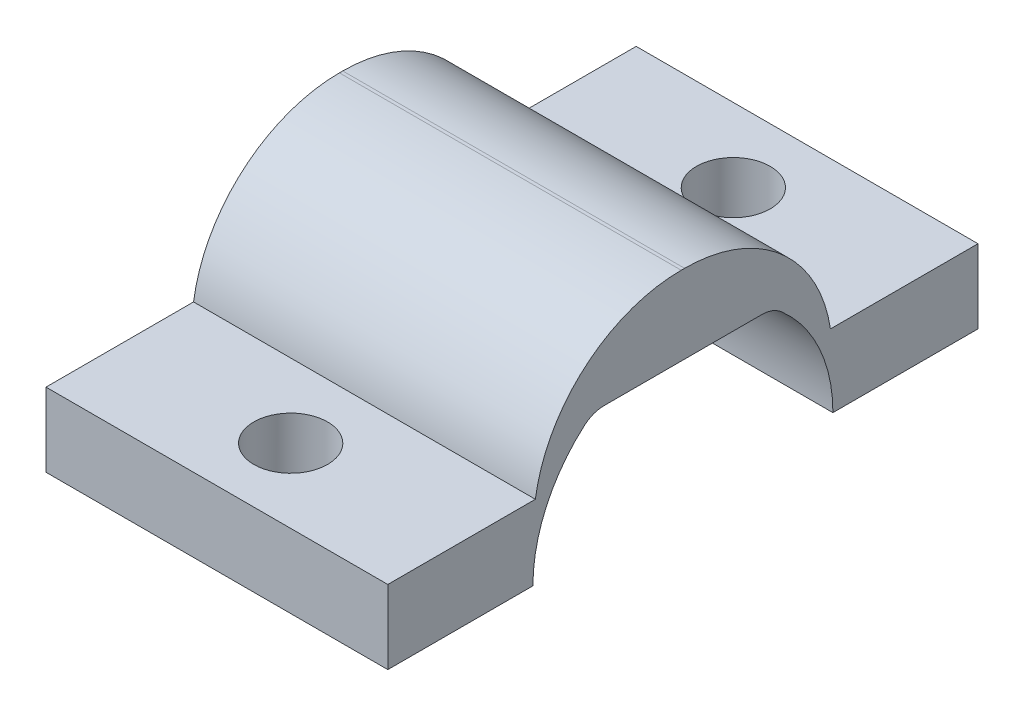
ISO-10303-21;
HEADER;
FILE_DESCRIPTION(('STEP AP214'),'2;1');
FILE_NAME('part.step','',(''),(''),'','','');
FILE_SCHEMA(('AUTOMOTIVE_DESIGN { 1 0 10303 214 1 1 1 1 }'));
ENDSEC;
DATA;
#1=APPLICATION_CONTEXT('core data for automotive mechanical design processes');
#2=APPLICATION_PROTOCOL_DEFINITION('international standard','automotive_design',2000,#1);
#3=PRODUCT_CONTEXT('',#1,'mechanical');
#4=PRODUCT('Part','Part','',(#3));
#5=PRODUCT_RELATED_PRODUCT_CATEGORY('part','',(#4));
#6=PRODUCT_DEFINITION_FORMATION('','',#4);
#7=PRODUCT_DEFINITION_CONTEXT('part definition',#1,'design');
#8=PRODUCT_DEFINITION('design','',#6,#7);
#9=PRODUCT_DEFINITION_SHAPE('','',#8);
#10=(LENGTH_UNIT() NAMED_UNIT(*) SI_UNIT(.MILLI.,.METRE.));
#11=(NAMED_UNIT(*) PLANE_ANGLE_UNIT() SI_UNIT($,.RADIAN.));
#12=(NAMED_UNIT(*) SI_UNIT($,.STERADIAN.) SOLID_ANGLE_UNIT());
#13=UNCERTAINTY_MEASURE_WITH_UNIT(LENGTH_MEASURE(1.E-05),#10,'distance_accuracy_value','');
#14=(GEOMETRIC_REPRESENTATION_CONTEXT(3) GLOBAL_UNCERTAINTY_ASSIGNED_CONTEXT((#13)) GLOBAL_UNIT_ASSIGNED_CONTEXT((#10,
#11,#12)) REPRESENTATION_CONTEXT('',''));
#15=CARTESIAN_POINT('',(0.,0.,0.));
#16=DIRECTION('',(0.,0.,1.));
#17=DIRECTION('',(1.,0.,0.));
#18=AXIS2_PLACEMENT_3D('',#15,#16,#17);
#19=CARTESIAN_POINT('',(15.9,0.,0.));
#20=DIRECTION('',(-1.,0.,0.));
#21=DIRECTION('',(0.,0.,1.));
#22=AXIS2_PLACEMENT_3D('',#19,#20,#21);
#23=CYLINDRICAL_SURFACE('',#22,6.1);
#24=CARTESIAN_POINT('',(2.,0.,0.));
#25=DIRECTION('',(1.,0.,0.));
#26=DIRECTION('',(0.,0.,-1.));
#27=AXIS2_PLACEMENT_3D('',#24,#25,#26);
#28=CIRCLE('',#27,6.1);
#29=CARTESIAN_POINT('',(2.,4.60612244897959,3.99920441900714));
#30=VERTEX_POINT('',#29);
#31=CARTESIAN_POINT('',(2.,0.,6.1));
#32=VERTEX_POINT('',#31);
#33=EDGE_CURVE('E214',#30,#32,#28,.T.);
#34=ORIENTED_EDGE('',*,*,#33,.F.);
#35=DIRECTION('',(-1.,0.,0.));
#36=VECTOR('',#35,1.);
#37=CARTESIAN_POINT('',(15.9,4.60612244897959,3.99920441900714));
#38=LINE('',#37,#36);
#39=CARTESIAN_POINT('',(15.9,4.60612244897959,3.99920441900714));
#40=VERTEX_POINT('',#39);
#41=EDGE_CURVE('E71',#30,#40,#38,.F.);
#42=ORIENTED_EDGE('',*,*,#41,.T.);
#43=CARTESIAN_POINT('',(15.9,0.,0.));
#44=DIRECTION('',(1.,0.,0.));
#45=DIRECTION('',(0.,0.,-1.));
#46=AXIS2_PLACEMENT_3D('',#43,#44,#45);
#47=CIRCLE('',#46,6.1);
#48=CARTESIAN_POINT('',(15.9,0.,6.1));
#49=VERTEX_POINT('',#48);
#50=EDGE_CURVE('E237',#40,#49,#47,.T.);
#51=ORIENTED_EDGE('',*,*,#50,.T.);
#52=DIRECTION('',(-1.,0.,0.));
#53=VECTOR('',#52,1.);
#54=CARTESIAN_POINT('',(15.9,0.,6.1));
#55=LINE('',#54,#53);
#56=EDGE_CURVE('E257',#49,#32,#55,.T.);
#57=ORIENTED_EDGE('',*,*,#56,.T.);
#58=EDGE_LOOP('',(#34,#42,#51,#57));
#59=FACE_BOUND('',#58,.T.);
#60=ADVANCED_FACE('F47',(#59),#23,.F.);
#61=CARTESIAN_POINT('',(15.9,4.9,0.));
#62=DIRECTION('',(0.,1.,0.));
#63=DIRECTION('',(0.,0.,1.));
#64=AXIS2_PLACEMENT_3D('',#61,#62,#63);
#65=PLANE('',#64);
#66=DIRECTION('',(-1.,0.,0.));
#67=VECTOR('',#66,1.);
#68=CARTESIAN_POINT('',(15.9,4.9,3.2124756808418));
#69=LINE('',#68,#67);
#70=CARTESIAN_POINT('',(15.9,4.9,3.2124756808418));
#71=VERTEX_POINT('',#70);
#72=CARTESIAN_POINT('',(2.,4.9,3.2124756808418));
#73=VERTEX_POINT('',#72);
#74=EDGE_CURVE('E289',#71,#73,#69,.T.);
#75=ORIENTED_EDGE('',*,*,#74,.T.);
#76=DIRECTION('',(0.,0.,-1.));
#77=VECTOR('',#76,1.);
#78=CARTESIAN_POINT('',(2.,4.9,0.));
#79=LINE('',#78,#77);
#80=CARTESIAN_POINT('',(2.,4.9,-3.2124756808418));
#81=VERTEX_POINT('',#80);
#82=EDGE_CURVE('E64',#73,#81,#79,.T.);
#83=ORIENTED_EDGE('',*,*,#82,.T.);
#84=DIRECTION('',(-1.,0.,0.));
#85=VECTOR('',#84,1.);
#86=CARTESIAN_POINT('',(15.9,4.9,-3.2124756808418));
#87=LINE('',#86,#85);
#88=CARTESIAN_POINT('',(15.9,4.9,-3.2124756808418));
#89=VERTEX_POINT('',#88);
#90=EDGE_CURVE('E293',#81,#89,#87,.F.);
#91=ORIENTED_EDGE('',*,*,#90,.T.);
#92=DIRECTION('',(0.,0.,-1.));
#93=VECTOR('',#92,1.);
#94=CARTESIAN_POINT('',(15.9,4.9,0.));
#95=LINE('',#94,#93);
#96=EDGE_CURVE('E240',#71,#89,#95,.T.);
#97=ORIENTED_EDGE('',*,*,#96,.F.);
#98=EDGE_LOOP('',(#75,#83,#91,#97));
#99=FACE_BOUND('',#98,.T.);
#100=ADVANCED_FACE('F309',(#99),#65,.F.);
#101=CARTESIAN_POINT('',(2.,0.,0.));
#102=DIRECTION('',(1.,0.,0.));
#103=DIRECTION('',(0.,0.,-1.));
#104=AXIS2_PLACEMENT_3D('',#101,#102,#103);
#105=CIRCLE('',#104,6.1);
#106=CARTESIAN_POINT('',(2.,0.,-6.1));
#107=VERTEX_POINT('',#106);
#108=CARTESIAN_POINT('',(2.,4.60612244897959,-3.99920441900714));
#109=VERTEX_POINT('',#108);
#110=EDGE_CURVE('E221',#107,#109,#105,.T.);
#111=ORIENTED_EDGE('',*,*,#110,.F.);
#112=DIRECTION('',(-1.,0.,0.));
#113=VECTOR('',#112,1.);
#114=CARTESIAN_POINT('',(15.9,0.,-6.1));
#115=LINE('',#114,#113);
#116=CARTESIAN_POINT('',(15.9,0.,-6.1));
#117=VERTEX_POINT('',#116);
#118=EDGE_CURVE('E269',#117,#107,#115,.T.);
#119=ORIENTED_EDGE('',*,*,#118,.F.);
#120=CARTESIAN_POINT('',(15.9,4.60612244897959,-3.99920441900714));
#121=VERTEX_POINT('',#120);
#122=EDGE_CURVE('E158',#117,#121,#47,.T.);
#123=ORIENTED_EDGE('',*,*,#122,.T.);
#124=DIRECTION('',(-1.,0.,0.));
#125=VECTOR('',#124,1.);
#126=CARTESIAN_POINT('',(15.9,4.60612244897959,-3.99920441900714));
#127=LINE('',#126,#125);
#128=EDGE_CURVE('E285',#121,#109,#127,.T.);
#129=ORIENTED_EDGE('',*,*,#128,.T.);
#130=EDGE_LOOP('',(#111,#119,#123,#129));
#131=FACE_BOUND('',#130,.T.);
#132=ADVANCED_FACE('F350',(#131),#23,.F.);
#133=CARTESIAN_POINT('',(15.9,0.,0.));
#134=DIRECTION('',(0.,1.,0.));
#135=DIRECTION('',(0.,0.,1.));
#136=AXIS2_PLACEMENT_3D('',#133,#134,#135);
#137=PLANE('',#136);
#138=CARTESIAN_POINT('',(8.95,0.,-9.));
#139=DIRECTION('',(0.,1.,0.));
#140=DIRECTION('',(0.,0.,1.));
#141=AXIS2_PLACEMENT_3D('',#138,#139,#140);
#142=CIRCLE('',#141,1.5);
#143=CARTESIAN_POINT('',(8.95,0.,-7.5));
#144=VERTEX_POINT('',#143);
#145=EDGE_CURVE('E179',#144,#144,#142,.T.);
#146=ORIENTED_EDGE('',*,*,#145,.T.);
#147=EDGE_LOOP('',(#146));
#148=FACE_BOUND('',#147,.T.);
#149=ORIENTED_EDGE('',*,*,#118,.T.);
#150=DIRECTION('',(0.,0.,-1.));
#151=VECTOR('',#150,1.);
#152=CARTESIAN_POINT('',(2.,0.,-10.));
#153=LINE('',#152,#151);
#154=CARTESIAN_POINT('',(2.,0.,-12.));
#155=VERTEX_POINT('',#154);
#156=EDGE_CURVE('E167',#107,#155,#153,.T.);
#157=ORIENTED_EDGE('',*,*,#156,.T.);
#158=DIRECTION('',(-1.,0.,0.));
#159=VECTOR('',#158,1.);
#160=CARTESIAN_POINT('',(15.9,0.,-12.));
#161=LINE('',#160,#159);
#162=CARTESIAN_POINT('',(15.9,0.,-12.));
#163=VERTEX_POINT('',#162);
#164=EDGE_CURVE('E165',#163,#155,#161,.T.);
#165=ORIENTED_EDGE('',*,*,#164,.F.);
#166=DIRECTION('',(0.,0.,-1.));
#167=VECTOR('',#166,1.);
#168=CARTESIAN_POINT('',(15.9,0.,0.));
#169=LINE('',#168,#167);
#170=EDGE_CURVE('E151',#117,#163,#169,.T.);
#171=ORIENTED_EDGE('',*,*,#170,.F.);
#172=EDGE_LOOP('',(#149,#157,#165,#171));
#173=FACE_BOUND('',#172,.T.);
#174=ADVANCED_FACE('F166',(#148,#173),#137,.F.);
#175=CARTESIAN_POINT('',(15.9,3.,0.));
#176=DIRECTION('',(0.,-1.,0.));
#177=DIRECTION('',(0.,0.,-1.));
#178=AXIS2_PLACEMENT_3D('',#175,#176,#177);
#179=PLANE('',#178);
#180=CARTESIAN_POINT('',(8.95,3.,-9.));
#181=DIRECTION('',(0.,1.,0.));
#182=DIRECTION('',(0.,0.,1.));
#183=AXIS2_PLACEMENT_3D('',#180,#181,#182);
#184=CIRCLE('',#183,1.5);
#185=CARTESIAN_POINT('',(8.95,3.,-7.5));
#186=VERTEX_POINT('',#185);
#187=EDGE_CURVE('E400',#186,#186,#184,.T.);
#188=ORIENTED_EDGE('',*,*,#187,.F.);
#189=EDGE_LOOP('',(#188));
#190=FACE_BOUND('',#189,.T.);
#191=DIRECTION('',(0.,0.,1.));
#192=VECTOR('',#191,1.);
#193=CARTESIAN_POINT('',(15.9,3.,0.));
#194=LINE('',#193,#192);
#195=CARTESIAN_POINT('',(15.9,3.,-12.));
#196=VERTEX_POINT('',#195);
#197=CARTESIAN_POINT('',(15.9,3.,-6.));
#198=VERTEX_POINT('',#197);
#199=EDGE_CURVE('E162',#196,#198,#194,.T.);
#200=ORIENTED_EDGE('',*,*,#199,.F.);
#201=DIRECTION('',(1.,0.,0.));
#202=VECTOR('',#201,1.);
#203=CARTESIAN_POINT('',(15.9,3.,-12.));
#204=LINE('',#203,#202);
#205=CARTESIAN_POINT('',(2.,3.,-12.));
#206=VERTEX_POINT('',#205);
#207=EDGE_CURVE('E177',#206,#196,#204,.T.);
#208=ORIENTED_EDGE('',*,*,#207,.F.);
#209=DIRECTION('',(0.,0.,1.));
#210=VECTOR('',#209,1.);
#211=CARTESIAN_POINT('',(2.,3.,0.));
#212=LINE('',#211,#210);
#213=CARTESIAN_POINT('',(2.,3.,-6.));
#214=VERTEX_POINT('',#213);
#215=EDGE_CURVE('E227',#206,#214,#212,.T.);
#216=ORIENTED_EDGE('',*,*,#215,.T.);
#217=DIRECTION('',(-1.,0.,0.));
#218=VECTOR('',#217,1.);
#219=CARTESIAN_POINT('',(15.9,3.,-6.));
#220=LINE('',#219,#218);
#221=EDGE_CURVE('E265',#198,#214,#220,.T.);
#222=ORIENTED_EDGE('',*,*,#221,.F.);
#223=EDGE_LOOP('',(#200,#208,#216,#222));
#224=FACE_BOUND('',#223,.T.);
#225=ADVANCED_FACE('F340',(#190,#224),#179,.F.);
#226=CARTESIAN_POINT('',(15.9,8.1,0.));
#227=DIRECTION('',(0.,1.,0.));
#228=DIRECTION('',(0.,0.,1.));
#229=AXIS2_PLACEMENT_3D('',#226,#227,#228);
#230=PLANE('',#229);
#231=DIRECTION('',(0.,0.,-1.));
#232=VECTOR('',#231,1.);
#233=CARTESIAN_POINT('',(2.,8.1,-10.));
#234=LINE('',#233,#232);
#235=CARTESIAN_POINT('',(2.,8.1,0.0678840200144422));
#236=VERTEX_POINT('',#235);
#237=CARTESIAN_POINT('',(2.,8.1,-0.0678840200144405));
#238=VERTEX_POINT('',#237);
#239=EDGE_CURVE('E206',#236,#238,#234,.T.);
#240=ORIENTED_EDGE('',*,*,#239,.F.);
#241=DIRECTION('',(1.,0.,0.));
#242=VECTOR('',#241,1.);
#243=CARTESIAN_POINT('',(15.9,8.1,0.0678840200144413));
#244=LINE('',#243,#242);
#245=CARTESIAN_POINT('',(15.9,8.1,0.0678840200144413));
#246=VERTEX_POINT('',#245);
#247=EDGE_CURVE('E276',#236,#246,#244,.T.);
#248=ORIENTED_EDGE('',*,*,#247,.T.);
#249=DIRECTION('',(0.,0.,-1.));
#250=VECTOR('',#249,1.);
#251=CARTESIAN_POINT('',(15.9,8.1,0.));
#252=LINE('',#251,#250);
#253=CARTESIAN_POINT('',(15.9,8.1,-0.0678840200144413));
#254=VERTEX_POINT('',#253);
#255=EDGE_CURVE('E246',#246,#254,#252,.T.);
#256=ORIENTED_EDGE('',*,*,#255,.T.);
#257=DIRECTION('',(-1.,0.,0.));
#258=VECTOR('',#257,1.);
#259=CARTESIAN_POINT('',(0.,8.1,-0.0678840200144413));
#260=LINE('',#259,#258);
#261=EDGE_CURVE('E272',#254,#238,#260,.T.);
#262=ORIENTED_EDGE('',*,*,#261,.T.);
#263=EDGE_LOOP('',(#240,#248,#256,#262));
#264=FACE_BOUND('',#263,.T.);
#265=ADVANCED_FACE('F332',(#264),#230,.T.);
#266=CARTESIAN_POINT('',(15.9,3.,0.));
#267=DIRECTION('',(0.,1.,0.));
#268=DIRECTION('',(0.,0.,1.));
#269=AXIS2_PLACEMENT_3D('',#266,#267,#268);
#270=PLANE('',#269);
#271=CARTESIAN_POINT('',(8.95,3.,9.));
#272=DIRECTION('',(0.,1.,0.));
#273=DIRECTION('',(0.,0.,1.));
#274=AXIS2_PLACEMENT_3D('',#271,#272,#273);
#275=CIRCLE('',#274,1.5);
#276=CARTESIAN_POINT('',(8.95,3.,10.5));
#277=VERTEX_POINT('',#276);
#278=EDGE_CURVE('E397',#277,#277,#275,.T.);
#279=ORIENTED_EDGE('',*,*,#278,.F.);
#280=EDGE_LOOP('',(#279));
#281=FACE_BOUND('',#280,.T.);
#282=DIRECTION('',(0.,0.,-1.));
#283=VECTOR('',#282,1.);
#284=CARTESIAN_POINT('',(2.,3.,0.));
#285=LINE('',#284,#283);
#286=CARTESIAN_POINT('',(2.,3.,12.));
#287=VERTEX_POINT('',#286);
#288=CARTESIAN_POINT('',(2.,3.,6.));
#289=VERTEX_POINT('',#288);
#290=EDGE_CURVE('E234',#287,#289,#285,.T.);
#291=ORIENTED_EDGE('',*,*,#290,.F.);
#292=DIRECTION('',(-1.,0.,0.));
#293=VECTOR('',#292,1.);
#294=CARTESIAN_POINT('',(2.,3.,12.));
#295=LINE('',#294,#293);
#296=CARTESIAN_POINT('',(15.9,3.,12.));
#297=VERTEX_POINT('',#296);
#298=EDGE_CURVE('E202',#297,#287,#295,.T.);
#299=ORIENTED_EDGE('',*,*,#298,.F.);
#300=DIRECTION('',(0.,0.,-1.));
#301=VECTOR('',#300,1.);
#302=CARTESIAN_POINT('',(15.9,3.,0.));
#303=LINE('',#302,#301);
#304=CARTESIAN_POINT('',(15.9,3.,6.));
#305=VERTEX_POINT('',#304);
#306=EDGE_CURVE('E250',#297,#305,#303,.T.);
#307=ORIENTED_EDGE('',*,*,#306,.T.);
#308=DIRECTION('',(-1.,0.,0.));
#309=VECTOR('',#308,1.);
#310=CARTESIAN_POINT('',(15.9,3.,6.));
#311=LINE('',#310,#309);
#312=EDGE_CURVE('E261',#305,#289,#311,.T.);
#313=ORIENTED_EDGE('',*,*,#312,.T.);
#314=EDGE_LOOP('',(#291,#299,#307,#313));
#315=FACE_BOUND('',#314,.T.);
#316=ADVANCED_FACE('F323',(#281,#315),#270,.T.);
#317=CARTESIAN_POINT('',(15.9,0.,0.));
#318=DIRECTION('',(0.,-1.,0.));
#319=DIRECTION('',(0.,0.,-1.));
#320=AXIS2_PLACEMENT_3D('',#317,#318,#319);
#321=PLANE('',#320);
#322=CARTESIAN_POINT('',(8.95,0.,9.));
#323=DIRECTION('',(0.,-1.,0.));
#324=DIRECTION('',(0.,0.,-1.));
#325=AXIS2_PLACEMENT_3D('',#322,#323,#324);
#326=CIRCLE('',#325,1.5);
#327=CARTESIAN_POINT('',(8.95,0.,7.5));
#328=VERTEX_POINT('',#327);
#329=EDGE_CURVE('E51',#328,#328,#326,.T.);
#330=ORIENTED_EDGE('',*,*,#329,.F.);
#331=EDGE_LOOP('',(#330));
#332=FACE_BOUND('',#331,.T.);
#333=CARTESIAN_POINT('',(2.,0.,12.));
#334=VERTEX_POINT('',#333);
#335=EDGE_CURVE('E211',#334,#32,#153,.T.);
#336=ORIENTED_EDGE('',*,*,#335,.T.);
#337=ORIENTED_EDGE('',*,*,#56,.F.);
#338=DIRECTION('',(0.,0.,1.));
#339=VECTOR('',#338,1.);
#340=CARTESIAN_POINT('',(15.9,0.,0.));
#341=LINE('',#340,#339);
#342=CARTESIAN_POINT('',(15.9,0.,12.));
#343=VERTEX_POINT('',#342);
#344=EDGE_CURVE('E254',#49,#343,#341,.T.);
#345=ORIENTED_EDGE('',*,*,#344,.T.);
#346=DIRECTION('',(1.,0.,0.));
#347=VECTOR('',#346,1.);
#348=CARTESIAN_POINT('',(2.,0.,12.));
#349=LINE('',#348,#347);
#350=EDGE_CURVE('E194',#334,#343,#349,.T.);
#351=ORIENTED_EDGE('',*,*,#350,.F.);
#352=EDGE_LOOP('',(#336,#337,#345,#351));
#353=FACE_BOUND('',#352,.T.);
#354=ADVANCED_FACE('F315',(#332,#353),#321,.T.);
#355=CARTESIAN_POINT('',(15.9,0.,0.));
#356=DIRECTION('',(1.,0.,0.));
#357=DIRECTION('',(0.,0.,-1.));
#358=AXIS2_PLACEMENT_3D('',#355,#356,#357);
#359=PLANE('',#358);
#360=ORIENTED_EDGE('',*,*,#255,.F.);
#361=CARTESIAN_POINT('',(15.9,2.1,0.0678840200144413));
#362=DIRECTION('',(1.,0.,0.));
#363=DIRECTION('',(0.,0.,-1.));
#364=AXIS2_PLACEMENT_3D('',#361,#362,#363);
#365=CIRCLE('',#364,6.);
#366=EDGE_CURVE('E282',#246,#305,#365,.T.);
#367=ORIENTED_EDGE('',*,*,#366,.T.);
#368=ORIENTED_EDGE('',*,*,#306,.F.);
#369=DIRECTION('',(0.,1.,0.));
#370=VECTOR('',#369,1.);
#371=CARTESIAN_POINT('',(15.9,3.,12.));
#372=LINE('',#371,#370);
#373=EDGE_CURVE('E198',#343,#297,#372,.T.);
#374=ORIENTED_EDGE('',*,*,#373,.F.);
#375=ORIENTED_EDGE('',*,*,#344,.F.);
#376=ORIENTED_EDGE('',*,*,#50,.F.);
#377=CARTESIAN_POINT('',(15.9,3.7,3.2124756808418));
#378=DIRECTION('',(1.,0.,0.));
#379=DIRECTION('',(0.,0.,-1.));
#380=AXIS2_PLACEMENT_3D('',#377,#378,#379);
#381=CIRCLE('',#380,1.2);
#382=EDGE_CURVE('E57',#40,#71,#381,.F.);
#383=ORIENTED_EDGE('',*,*,#382,.T.);
#384=ORIENTED_EDGE('',*,*,#96,.T.);
#385=CARTESIAN_POINT('',(15.9,3.7,-3.2124756808418));
#386=DIRECTION('',(1.,0.,0.));
#387=DIRECTION('',(0.,0.,-1.));
#388=AXIS2_PLACEMENT_3D('',#385,#386,#387);
#389=CIRCLE('',#388,1.2);
#390=EDGE_CURVE('E298',#89,#121,#389,.F.);
#391=ORIENTED_EDGE('',*,*,#390,.T.);
#392=ORIENTED_EDGE('',*,*,#122,.F.);
#393=ORIENTED_EDGE('',*,*,#170,.T.);
#394=DIRECTION('',(0.,-1.,0.));
#395=VECTOR('',#394,1.);
#396=CARTESIAN_POINT('',(15.9,3.,-12.));
#397=LINE('',#396,#395);
#398=EDGE_CURVE('E156',#196,#163,#397,.T.);
#399=ORIENTED_EDGE('',*,*,#398,.F.);
#400=ORIENTED_EDGE('',*,*,#199,.T.);
#401=CARTESIAN_POINT('',(15.9,2.1,-0.0678840200144413));
#402=DIRECTION('',(1.,0.,0.));
#403=DIRECTION('',(0.,0.,-1.));
#404=AXIS2_PLACEMENT_3D('',#401,#402,#403);
#405=CIRCLE('',#404,6.);
#406=EDGE_CURVE('E279',#198,#254,#405,.T.);
#407=ORIENTED_EDGE('',*,*,#406,.T.);
#408=EDGE_LOOP('',(#360,#367,#368,#374,#375,#376,#383,#384,#391,#392,#393,#399,#400,#407));
#409=FACE_BOUND('',#408,.T.);
#410=ADVANCED_FACE('F154',(#409),#359,.T.);
#411=CARTESIAN_POINT('',(15.9,2.1,0.0678840200144413));
#412=DIRECTION('',(-1.,0.,0.));
#413=DIRECTION('',(0.,0.,1.));
#414=AXIS2_PLACEMENT_3D('',#411,#412,#413);
#415=CYLINDRICAL_SURFACE('',#414,6.);
#416=CARTESIAN_POINT('',(2.,2.1,0.0678840200144413));
#417=DIRECTION('',(1.,0.,0.));
#418=DIRECTION('',(0.,0.,-1.));
#419=AXIS2_PLACEMENT_3D('',#416,#417,#418);
#420=CIRCLE('',#419,6.);
#421=EDGE_CURVE('E231',#289,#236,#420,.F.);
#422=ORIENTED_EDGE('',*,*,#421,.F.);
#423=ORIENTED_EDGE('',*,*,#312,.F.);
#424=ORIENTED_EDGE('',*,*,#366,.F.);
#425=ORIENTED_EDGE('',*,*,#247,.F.);
#426=EDGE_LOOP('',(#422,#423,#424,#425));
#427=FACE_BOUND('',#426,.T.);
#428=ADVANCED_FACE('F329',(#427),#415,.T.);
#429=CARTESIAN_POINT('',(15.9,2.1,-0.0678840200144413));
#430=DIRECTION('',(1.,0.,0.));
#431=DIRECTION('',(0.,0.,-1.));
#432=AXIS2_PLACEMENT_3D('',#429,#430,#431);
#433=CYLINDRICAL_SURFACE('',#432,6.);
#434=CARTESIAN_POINT('',(2.,2.1,-0.0678840200144413));
#435=DIRECTION('',(1.,0.,0.));
#436=DIRECTION('',(0.,0.,-1.));
#437=AXIS2_PLACEMENT_3D('',#434,#435,#436);
#438=CIRCLE('',#437,6.);
#439=EDGE_CURVE('E224',#238,#214,#438,.F.);
#440=ORIENTED_EDGE('',*,*,#439,.F.);
#441=ORIENTED_EDGE('',*,*,#261,.F.);
#442=ORIENTED_EDGE('',*,*,#406,.F.);
#443=ORIENTED_EDGE('',*,*,#221,.T.);
#444=EDGE_LOOP('',(#440,#441,#442,#443));
#445=FACE_BOUND('',#444,.T.);
#446=ADVANCED_FACE('F338',(#445),#433,.T.);
#447=CARTESIAN_POINT('',(15.9,3.7,-3.2124756808418));
#448=DIRECTION('',(-1.,0.,0.));
#449=DIRECTION('',(0.,0.,1.));
#450=AXIS2_PLACEMENT_3D('',#447,#448,#449);
#451=CYLINDRICAL_SURFACE('',#450,1.2);
#452=ORIENTED_EDGE('',*,*,#90,.F.);
#453=CARTESIAN_POINT('',(2.,3.7,-3.2124756808418));
#454=DIRECTION('',(1.,0.,0.));
#455=DIRECTION('',(0.,0.,-1.));
#456=AXIS2_PLACEMENT_3D('',#453,#454,#455);
#457=CIRCLE('',#456,1.2);
#458=EDGE_CURVE('E217',#81,#109,#457,.F.);
#459=ORIENTED_EDGE('',*,*,#458,.T.);
#460=ORIENTED_EDGE('',*,*,#128,.F.);
#461=ORIENTED_EDGE('',*,*,#390,.F.);
#462=EDGE_LOOP('',(#452,#459,#460,#461));
#463=FACE_BOUND('',#462,.T.);
#464=ADVANCED_FACE('F367',(#463),#451,.F.);
#465=CARTESIAN_POINT('',(15.9,3.7,3.2124756808418));
#466=DIRECTION('',(-1.,0.,0.));
#467=DIRECTION('',(0.,0.,1.));
#468=AXIS2_PLACEMENT_3D('',#465,#466,#467);
#469=CYLINDRICAL_SURFACE('',#468,1.2);
#470=ORIENTED_EDGE('',*,*,#41,.F.);
#471=CARTESIAN_POINT('',(2.,3.7,3.2124756808418));
#472=DIRECTION('',(1.,0.,0.));
#473=DIRECTION('',(0.,0.,-1.));
#474=AXIS2_PLACEMENT_3D('',#471,#472,#473);
#475=CIRCLE('',#474,1.2);
#476=EDGE_CURVE('E11',#30,#73,#475,.F.);
#477=ORIENTED_EDGE('',*,*,#476,.T.);
#478=ORIENTED_EDGE('',*,*,#74,.F.);
#479=ORIENTED_EDGE('',*,*,#382,.F.);
#480=EDGE_LOOP('',(#470,#477,#478,#479));
#481=FACE_BOUND('',#480,.T.);
#482=ADVANCED_FACE('F49',(#481),#469,.F.);
#483=CARTESIAN_POINT('',(2.,0.,-10.));
#484=DIRECTION('',(1.,0.,0.));
#485=DIRECTION('',(0.,0.,-1.));
#486=AXIS2_PLACEMENT_3D('',#483,#484,#485);
#487=PLANE('',#486);
#488=ORIENTED_EDGE('',*,*,#335,.F.);
#489=DIRECTION('',(0.,-1.,0.));
#490=VECTOR('',#489,1.);
#491=CARTESIAN_POINT('',(2.,3.,12.));
#492=LINE('',#491,#490);
#493=EDGE_CURVE('E190',#287,#334,#492,.T.);
#494=ORIENTED_EDGE('',*,*,#493,.F.);
#495=ORIENTED_EDGE('',*,*,#290,.T.);
#496=ORIENTED_EDGE('',*,*,#421,.T.);
#497=ORIENTED_EDGE('',*,*,#239,.T.);
#498=ORIENTED_EDGE('',*,*,#439,.T.);
#499=ORIENTED_EDGE('',*,*,#215,.F.);
#500=DIRECTION('',(0.,1.,0.));
#501=VECTOR('',#500,1.);
#502=CARTESIAN_POINT('',(2.,3.,-12.));
#503=LINE('',#502,#501);
#504=EDGE_CURVE('E172',#155,#206,#503,.T.);
#505=ORIENTED_EDGE('',*,*,#504,.F.);
#506=ORIENTED_EDGE('',*,*,#156,.F.);
#507=ORIENTED_EDGE('',*,*,#110,.T.);
#508=ORIENTED_EDGE('',*,*,#458,.F.);
#509=ORIENTED_EDGE('',*,*,#82,.F.);
#510=ORIENTED_EDGE('',*,*,#476,.F.);
#511=ORIENTED_EDGE('',*,*,#33,.T.);
#512=EDGE_LOOP('',(#488,#494,#495,#496,#497,#498,#499,#505,#506,#507,#508,#509,#510,#511));
#513=FACE_BOUND('',#512,.T.);
#514=ADVANCED_FACE('F311',(#513),#487,.F.);
#515=CARTESIAN_POINT('',(0.,0.,12.));
#516=DIRECTION('',(0.,0.,1.));
#517=DIRECTION('',(1.,0.,0.));
#518=AXIS2_PLACEMENT_3D('',#515,#516,#517);
#519=PLANE('',#518);
#520=ORIENTED_EDGE('',*,*,#493,.T.);
#521=ORIENTED_EDGE('',*,*,#350,.T.);
#522=ORIENTED_EDGE('',*,*,#373,.T.);
#523=ORIENTED_EDGE('',*,*,#298,.T.);
#524=EDGE_LOOP('',(#520,#521,#522,#523));
#525=FACE_BOUND('',#524,.T.);
#526=ADVANCED_FACE('F320',(#525),#519,.T.);
#527=CARTESIAN_POINT('',(0.,0.,-12.));
#528=DIRECTION('',(0.,0.,-1.));
#529=DIRECTION('',(-1.,0.,0.));
#530=AXIS2_PLACEMENT_3D('',#527,#528,#529);
#531=PLANE('',#530);
#532=ORIENTED_EDGE('',*,*,#398,.T.);
#533=ORIENTED_EDGE('',*,*,#164,.T.);
#534=ORIENTED_EDGE('',*,*,#504,.T.);
#535=ORIENTED_EDGE('',*,*,#207,.T.);
#536=EDGE_LOOP('',(#532,#533,#534,#535));
#537=FACE_BOUND('',#536,.T.);
#538=ADVANCED_FACE('F175',(#537),#531,.T.);
#539=CARTESIAN_POINT('',(8.95,-7.,9.));
#540=DIRECTION('',(0.,1.,0.));
#541=DIRECTION('',(0.,0.,1.));
#542=AXIS2_PLACEMENT_3D('',#539,#540,#541);
#543=CYLINDRICAL_SURFACE('',#542,1.5);
#544=ORIENTED_EDGE('',*,*,#329,.T.);
#545=EDGE_LOOP('',(#544));
#546=FACE_BOUND('',#545,.T.);
#547=ORIENTED_EDGE('',*,*,#278,.T.);
#548=EDGE_LOOP('',(#547));
#549=FACE_BOUND('',#548,.T.);
#550=ADVANCED_FACE('F409',(#546,#549),#543,.F.);
#551=CARTESIAN_POINT('',(8.95,-7.,-9.));
#552=DIRECTION('',(0.,1.,0.));
#553=DIRECTION('',(0.,0.,1.));
#554=AXIS2_PLACEMENT_3D('',#551,#552,#553);
#555=CYLINDRICAL_SURFACE('',#554,1.5);
#556=ORIENTED_EDGE('',*,*,#187,.T.);
#557=EDGE_LOOP('',(#556));
#558=FACE_BOUND('',#557,.T.);
#559=ORIENTED_EDGE('',*,*,#145,.F.);
#560=EDGE_LOOP('',(#559));
#561=FACE_BOUND('',#560,.T.);
#562=ADVANCED_FACE('F411',(#558,#561),#555,.F.);
#563=CLOSED_SHELL('',(#60,#100,#132,#174,#225,#265,#316,#354,#410,#428,#446,#464,#482,#514,#526,
#538,#550,#562));
#564=MANIFOLD_SOLID_BREP('B2',#563);
#565=ADVANCED_BREP_SHAPE_REPRESENTATION('',(#18,#564),#14);
#566=SHAPE_DEFINITION_REPRESENTATION(#9,#565);
ENDSEC;
END-ISO-10303-21;
